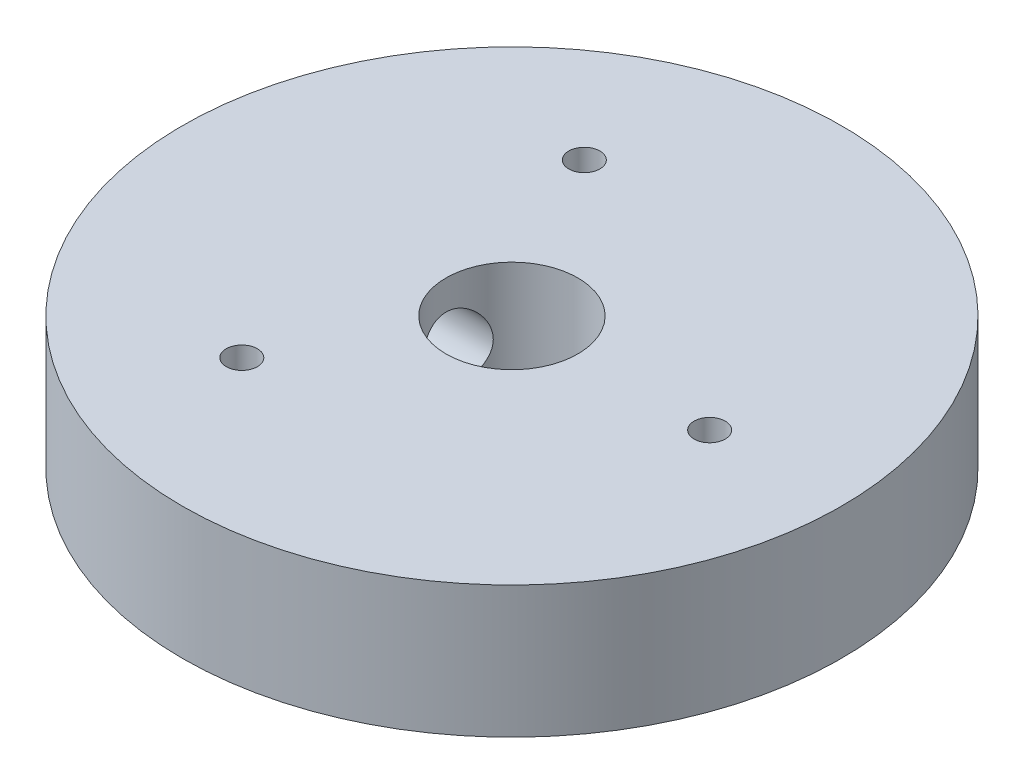
ISO-10303-21;
HEADER;
FILE_DESCRIPTION(('STEP AP214'),'2;1');
FILE_NAME('part.step','',(''),(''),'','','');
FILE_SCHEMA(('AUTOMOTIVE_DESIGN { 1 0 10303 214 1 1 1 1 }'));
ENDSEC;
DATA;
#1=APPLICATION_CONTEXT('core data for automotive mechanical design processes');
#2=APPLICATION_PROTOCOL_DEFINITION('international standard','automotive_design',2000,#1);
#3=PRODUCT_CONTEXT('',#1,'mechanical');
#4=PRODUCT('Part','Part','',(#3));
#5=PRODUCT_RELATED_PRODUCT_CATEGORY('part','',(#4));
#6=PRODUCT_DEFINITION_FORMATION('','',#4);
#7=PRODUCT_DEFINITION_CONTEXT('part definition',#1,'design');
#8=PRODUCT_DEFINITION('design','',#6,#7);
#9=PRODUCT_DEFINITION_SHAPE('','',#8);
#10=(LENGTH_UNIT() NAMED_UNIT(*) SI_UNIT(.MILLI.,.METRE.));
#11=(NAMED_UNIT(*) PLANE_ANGLE_UNIT() SI_UNIT($,.RADIAN.));
#12=(NAMED_UNIT(*) SI_UNIT($,.STERADIAN.) SOLID_ANGLE_UNIT());
#13=UNCERTAINTY_MEASURE_WITH_UNIT(LENGTH_MEASURE(1.E-05),#10,'distance_accuracy_value','');
#14=(GEOMETRIC_REPRESENTATION_CONTEXT(3) GLOBAL_UNCERTAINTY_ASSIGNED_CONTEXT((#13)) GLOBAL_UNIT_ASSIGNED_CONTEXT((#10,
#11,#12)) REPRESENTATION_CONTEXT('',''));
#15=CARTESIAN_POINT('',(0.,0.,0.));
#16=DIRECTION('',(0.,0.,1.));
#17=DIRECTION('',(1.,0.,0.));
#18=AXIS2_PLACEMENT_3D('',#15,#16,#17);
#19=CARTESIAN_POINT('',(0.,3.175,0.));
#20=DIRECTION('',(0.,1.,0.));
#21=DIRECTION('',(0.,0.,1.));
#22=AXIS2_PLACEMENT_3D('',#19,#20,#21);
#23=PLANE('',#22);
#24=CARTESIAN_POINT('',(-4.76249999999999,3.175,8.24889197104678));
#25=DIRECTION('',(0.,1.,0.));
#26=DIRECTION('',(0.,0.,1.));
#27=AXIS2_PLACEMENT_3D('',#24,#25,#26);
#28=CIRCLE('',#27,0.750387242491504);
#29=CARTESIAN_POINT('',(-4.76249999999999,3.175,8.99927921353829));
#30=VERTEX_POINT('',#29);
#31=EDGE_CURVE('E76',#30,#30,#28,.T.);
#32=ORIENTED_EDGE('',*,*,#31,.F.);
#33=EDGE_LOOP('',(#32));
#34=FACE_BOUND('',#33,.T.);
#35=CARTESIAN_POINT('',(0.,3.175,0.));
#36=DIRECTION('',(0.,1.,0.));
#37=DIRECTION('',(0.,0.,1.));
#38=AXIS2_PLACEMENT_3D('',#35,#36,#37);
#39=CIRCLE('',#38,3.175);
#40=CARTESIAN_POINT('',(0.,3.175,3.175));
#41=VERTEX_POINT('',#40);
#42=EDGE_CURVE('E62',#41,#41,#39,.T.);
#43=ORIENTED_EDGE('',*,*,#42,.F.);
#44=EDGE_LOOP('',(#43));
#45=FACE_BOUND('',#44,.T.);
#46=CARTESIAN_POINT('',(0.,3.175,0.));
#47=DIRECTION('',(0.,1.,0.));
#48=DIRECTION('',(0.,0.,1.));
#49=AXIS2_PLACEMENT_3D('',#46,#47,#48);
#50=CIRCLE('',#49,15.875);
#51=CARTESIAN_POINT('',(0.,3.175,15.875));
#52=VERTEX_POINT('',#51);
#53=EDGE_CURVE('E10',#52,#52,#50,.T.);
#54=ORIENTED_EDGE('',*,*,#53,.T.);
#55=EDGE_LOOP('',(#54));
#56=FACE_BOUND('',#55,.T.);
#57=CARTESIAN_POINT('',(9.525,3.175,0.));
#58=DIRECTION('',(0.,1.,0.));
#59=DIRECTION('',(0.,0.,1.));
#60=AXIS2_PLACEMENT_3D('',#57,#58,#59);
#61=CIRCLE('',#60,0.750387242491505);
#62=CARTESIAN_POINT('',(9.525,3.175,0.750387242491505));
#63=VERTEX_POINT('',#62);
#64=EDGE_CURVE('E68',#63,#63,#61,.T.);
#65=ORIENTED_EDGE('',*,*,#64,.F.);
#66=EDGE_LOOP('',(#65));
#67=FACE_BOUND('',#66,.T.);
#68=CARTESIAN_POINT('',(-4.7625,3.175,-8.24889197104678));
#69=DIRECTION('',(0.,1.,0.));
#70=DIRECTION('',(0.,0.,1.));
#71=AXIS2_PLACEMENT_3D('',#68,#69,#70);
#72=CIRCLE('',#71,0.750387242491505);
#73=CARTESIAN_POINT('',(-4.7625,3.175,-7.49850472855527));
#74=VERTEX_POINT('',#73);
#75=EDGE_CURVE('E84',#74,#74,#72,.T.);
#76=ORIENTED_EDGE('',*,*,#75,.F.);
#77=EDGE_LOOP('',(#76));
#78=FACE_BOUND('',#77,.T.);
#79=ADVANCED_FACE('F41',(#34,#45,#56,#67,#78),#23,.T.);
#80=CARTESIAN_POINT('',(0.,-3.175,0.));
#81=DIRECTION('',(0.,1.,0.));
#82=DIRECTION('',(0.,0.,1.));
#83=AXIS2_PLACEMENT_3D('',#80,#81,#82);
#84=PLANE('',#83);
#85=CARTESIAN_POINT('',(0.,-3.175,0.));
#86=DIRECTION('',(0.,1.,0.));
#87=DIRECTION('',(0.,0.,1.));
#88=AXIS2_PLACEMENT_3D('',#85,#86,#87);
#89=CIRCLE('',#88,15.875);
#90=CARTESIAN_POINT('',(0.,-3.175,15.875));
#91=VERTEX_POINT('',#90);
#92=EDGE_CURVE('E56',#91,#91,#89,.T.);
#93=ORIENTED_EDGE('',*,*,#92,.F.);
#94=EDGE_LOOP('',(#93));
#95=FACE_BOUND('',#94,.T.);
#96=CARTESIAN_POINT('',(0.,-3.175,0.));
#97=DIRECTION('',(0.,1.,0.));
#98=DIRECTION('',(0.,0.,1.));
#99=AXIS2_PLACEMENT_3D('',#96,#97,#98);
#100=CIRCLE('',#99,3.175);
#101=CARTESIAN_POINT('',(0.,-3.175,3.175));
#102=VERTEX_POINT('',#101);
#103=EDGE_CURVE('E64',#102,#102,#100,.T.);
#104=ORIENTED_EDGE('',*,*,#103,.T.);
#105=EDGE_LOOP('',(#104));
#106=FACE_BOUND('',#105,.T.);
#107=CARTESIAN_POINT('',(9.525,-3.175,0.));
#108=DIRECTION('',(0.,1.,0.));
#109=DIRECTION('',(0.,0.,1.));
#110=AXIS2_PLACEMENT_3D('',#107,#108,#109);
#111=CIRCLE('',#110,0.750387242491505);
#112=CARTESIAN_POINT('',(9.525,-3.175,0.750387242491505));
#113=VERTEX_POINT('',#112);
#114=EDGE_CURVE('E72',#113,#113,#111,.T.);
#115=ORIENTED_EDGE('',*,*,#114,.T.);
#116=EDGE_LOOP('',(#115));
#117=FACE_BOUND('',#116,.T.);
#118=CARTESIAN_POINT('',(-4.76249999999999,-3.175,8.24889197104678));
#119=DIRECTION('',(0.,1.,0.));
#120=DIRECTION('',(0.,0.,1.));
#121=AXIS2_PLACEMENT_3D('',#118,#119,#120);
#122=CIRCLE('',#121,0.750387242491504);
#123=CARTESIAN_POINT('',(-4.76249999999999,-3.175,8.99927921353829));
#124=VERTEX_POINT('',#123);
#125=EDGE_CURVE('E80',#124,#124,#122,.T.);
#126=ORIENTED_EDGE('',*,*,#125,.T.);
#127=EDGE_LOOP('',(#126));
#128=FACE_BOUND('',#127,.T.);
#129=CARTESIAN_POINT('',(-4.7625,-3.175,-8.24889197104678));
#130=DIRECTION('',(0.,1.,0.));
#131=DIRECTION('',(0.,0.,1.));
#132=AXIS2_PLACEMENT_3D('',#129,#130,#131);
#133=CIRCLE('',#132,0.750387242491505);
#134=CARTESIAN_POINT('',(-4.7625,-3.175,-7.49850472855527));
#135=VERTEX_POINT('',#134);
#136=EDGE_CURVE('E88',#135,#135,#133,.T.);
#137=ORIENTED_EDGE('',*,*,#136,.T.);
#138=EDGE_LOOP('',(#137));
#139=FACE_BOUND('',#138,.T.);
#140=ADVANCED_FACE('F124',(#95,#106,#117,#128,#139),#84,.F.);
#141=CARTESIAN_POINT('',(0.,3.175,0.));
#142=DIRECTION('',(0.,-1.,0.));
#143=DIRECTION('',(0.,0.,-1.));
#144=AXIS2_PLACEMENT_3D('',#141,#142,#143);
#145=CYLINDRICAL_SURFACE('',#144,15.875);
#146=CARTESIAN_POINT('',(-15.875,-1.750000056,0.));
#147=CARTESIAN_POINT('',(-15.8749987707504,-1.74999584185086,-0.0979793643530249));
#148=CARTESIAN_POINT('',(-15.8740833013667,-1.74174380277529,-0.196022150233042));
#149=CARTESIAN_POINT('',(-15.8705193526468,-1.70895155045262,-0.389385738105229));
#150=CARTESIAN_POINT('',(-15.8678690022144,-1.68439375077809,-0.484703485127764));
#151=CARTESIAN_POINT('',(-15.8611342387205,-1.61971693962202,-0.669789190422526));
#152=CARTESIAN_POINT('',(-15.8570507300743,-1.57960774040858,-0.75956060686708));
#153=CARTESIAN_POINT('',(-15.8479053217718,-1.48498669228053,-0.931078842194836));
#154=CARTESIAN_POINT('',(-15.8428436064379,-1.43047755602138,-1.01282716849133));
#155=CARTESIAN_POINT('',(-15.832283565769,-1.30835104975384,-1.16635129833459));
#156=CARTESIAN_POINT('',(-15.8267836315471,-1.24068392637024,-1.23808741687249));
#157=CARTESIAN_POINT('',(-15.8159802044649,-1.0942687401302,-1.36920942645987));
#158=CARTESIAN_POINT('',(-15.8106767210424,-1.01552014577331,-1.42859472478838));
#159=CARTESIAN_POINT('',(-15.8008505262322,-0.848924993605343,-1.53347299357972));
#160=CARTESIAN_POINT('',(-15.7963298762098,-0.76105536173159,-1.578929521488));
#161=CARTESIAN_POINT('',(-15.7886017252672,-0.578871890849666,-1.65442720826407));
#162=CARTESIAN_POINT('',(-15.7853941853144,-0.484558243488575,-1.68446882535031));
#163=CARTESIAN_POINT('',(-15.7806703494868,-0.292571858113271,-1.72816501837791));
#164=CARTESIAN_POINT('',(-15.7791472082895,-0.194914391305205,-1.74188593824553));
#165=CARTESIAN_POINT('',(-15.7779435139746,0.00132818929405485,-1.75275641347327));
#166=CARTESIAN_POINT('',(-15.7782629026333,0.099913273674305,-1.74990649247097));
#167=CARTESIAN_POINT('',(-15.7807019224249,0.29475337547144,-1.72777077884379));
#168=CARTESIAN_POINT('',(-15.7828135924459,0.391016764007342,-1.70855766836944));
#169=CARTESIAN_POINT('',(-15.7885868189893,0.57894442529153,-1.65435417633734));
#170=CARTESIAN_POINT('',(-15.7922484004842,0.670608623910321,-1.61936354056901));
#171=CARTESIAN_POINT('',(-15.8007179991703,0.846964040160319,-1.53451883504015));
#172=CARTESIAN_POINT('',(-15.8055284794751,0.931639743090616,-1.48463277281854));
#173=CARTESIAN_POINT('',(-15.8157518516358,1.09144467320651,-1.37143624395736));
#174=CARTESIAN_POINT('',(-15.8211647649281,1.16657356048189,-1.30812529954477));
#175=CARTESIAN_POINT('',(-15.8320185581079,1.30557439659657,-1.16947142581752));
#176=CARTESIAN_POINT('',(-15.8374594322491,1.36938379519243,-1.09406577254533));
#177=CARTESIAN_POINT('',(-15.847728784908,1.48344868087205,-0.933580066232353));
#178=CARTESIAN_POINT('',(-15.8525572624945,1.53370414734709,-0.848499998481936));
#179=CARTESIAN_POINT('',(-15.8610598804911,1.61923306738655,-0.671035359528453));
#180=CARTESIAN_POINT('',(-15.8647337544272,1.65450306307491,-0.578649108260965));
#181=CARTESIAN_POINT('',(-15.8705106365117,1.70901255824955,-0.389216300339645));
#182=CARTESIAN_POINT('',(-15.8726137017834,1.72825264067658,-0.292169913291171));
#183=CARTESIAN_POINT('',(-15.8750046399331,1.75007614450582,-0.096712983575378));
#184=CARTESIAN_POINT('',(-15.8753019126916,1.75274582314955,0.00168781785082944));
#185=CARTESIAN_POINT('',(-15.874073043414,1.7415797036682,0.197535415328228));
#186=CARTESIAN_POINT('',(-15.87254693142,1.72774417748232,0.294982227070652));
#187=CARTESIAN_POINT('',(-15.8678487150653,1.68403198885939,0.485904597899955));
#188=CARTESIAN_POINT('',(-15.8646807847588,1.65419599832553,0.579389580350867));
#189=CARTESIAN_POINT('',(-15.8570540340655,1.57937179861591,0.760028235948189));
#190=CARTESIAN_POINT('',(-15.8525951789162,1.53438318140011,0.847181738519446));
#191=CARTESIAN_POINT('',(-15.8428612389217,1.43031887501327,1.01307164683578));
#192=CARTESIAN_POINT('',(-15.8375829201735,1.37118684809846,1.09177251849359));
#193=CARTESIAN_POINT('',(-15.8268119373787,1.24059462690878,1.23816274044449));
#194=CARTESIAN_POINT('',(-15.8213192667711,1.1691340550484,1.30585175335472));
#195=CARTESIAN_POINT('',(-15.8107100734737,1.01553547987193,1.42859882917763));
#196=CARTESIAN_POINT('',(-15.805595310404,0.933351921211562,1.48360006057013));
#197=CARTESIAN_POINT('',(-15.7963487008554,0.760863550385964,1.57901887096793));
#198=CARTESIAN_POINT('',(-15.7922168384741,0.6705588696452,1.61943668592425));
#199=CARTESIAN_POINT('',(-15.7854152753184,0.484582147472773,1.68444740085582));
#200=CARTESIAN_POINT('',(-15.7827425148824,0.388921804954169,1.70907343448263));
#201=CARTESIAN_POINT('',(-15.7791525789664,0.194792749055371,1.74190875954436));
#202=CARTESIAN_POINT('',(-15.7782353412616,0.0963241353404615,1.75011863285375));
#203=CARTESIAN_POINT('',(-15.7782618172443,-0.100061266541459,1.74987952324859));
#204=CARTESIAN_POINT('',(-15.7791955582548,-0.197978176891494,1.74151981373045));
#205=CARTESIAN_POINT('',(-15.7827974525154,-0.391007035651755,1.70856673640226));
#206=CARTESIAN_POINT('',(-15.7854656071144,-0.486118981880618,1.68397335596795));
#207=CARTESIAN_POINT('',(-15.7922328084822,-0.670833051399155,1.61927697921681));
#208=CARTESIAN_POINT('',(-15.7963315528257,-0.760436334510245,1.57917726073254));
#209=CARTESIAN_POINT('',(-15.8054986823344,-0.931655560551822,1.48461545462339));
#210=CARTESIAN_POINT('',(-15.8105670688637,-1.01327149224439,1.43015334679154));
#211=CARTESIAN_POINT('',(-15.8211351459263,-1.16665650117076,1.30807874455527));
#212=CARTESIAN_POINT('',(-15.826636932568,-1.23837243958712,1.24039966058607));
#213=CARTESIAN_POINT('',(-15.8374329558805,-1.36946626129314,1.09394780586495));
#214=CARTESIAN_POINT('',(-15.8427271428449,-1.42884120419813,1.01517239876964));
#215=CARTESIAN_POINT('',(-15.8525284351924,-1.53371293329698,0.848499748931197));
#216=CARTESIAN_POINT('',(-15.8570331331814,-1.57916757669441,0.760575865487707));
#217=CARTESIAN_POINT('',(-15.8647225791226,-1.65460517533266,0.578347062586761));
#218=CARTESIAN_POINT('',(-15.8679087939638,-1.68460533373755,0.484049371034498));
#219=CARTESIAN_POINT('',(-15.8718140508065,-1.72091570865995,0.324362345388978));
#220=CARTESIAN_POINT('',(-15.8730031159235,-1.73180714458004,0.25998886124424));
#221=CARTESIAN_POINT('',(-15.8745964975978,-1.74635070179433,0.130419616769645));
#222=CARTESIAN_POINT('',(-15.8750008182989,-1.75000286131598,0.0652238607836776));
#223=CARTESIAN_POINT('',(-15.875,-1.750000056,0.));
#224=B_SPLINE_CURVE_WITH_KNOTS('',3,(#146,#147,#148,#149,#150,#151,#152,#153,#154,#155,#156,
#157,#158,#159,#160,#161,#162,#163,#164,#165,#166,#167,#168,#169,#170,#171,#172,#173,#174,#175,
#176,#177,#178,#179,#180,#181,#182,#183,#184,#185,#186,#187,#188,#189,#190,#191,#192,#193,#194,
#195,#196,#197,#198,#199,#200,#201,#202,#203,#204,#205,#206,#207,#208,#209,#210,#211,#212,#213,
#214,#215,#216,#217,#218,#219,#220,#221,#222,#223),.UNSPECIFIED.,.T.,.F.,(4,2,2,2,2,2,2,2,2,2,2,
2,2,2,2,2,2,2,2,2,2,2,2,2,2,2,2,2,2,2,2,2,2,2,2,2,2,2,4),(0.,0.293699894116223,
0.587717071206363,0.881549037129714,1.17532569050457,1.47023557519066,1.76515960946012,
2.06084880673068,2.3565292139345,2.65100352198026,2.94546852470618,3.23863235130914,
3.53180090159398,3.82560370616381,4.11941696852504,4.41480640062226,4.71019628185575,
5.00565428691476,5.30110154693553,5.59500955739081,5.88891272549456,6.18207233192447,
6.475239833383,6.76959515519251,7.06395949380344,7.3596178087775,7.65527133996119,
7.95030249595024,8.24532319430869,8.53875870419187,8.83219444226791,9.12556818582979,
9.41894234215225,9.71383458954611,10.0087970180838,10.3046437941381,10.6001605327694,
10.7956745809476,10.9911875966985),.UNSPECIFIED.);
#225=CARTESIAN_POINT('',(-15.875,-1.750000056,0.));
#226=VERTEX_POINT('',#225);
#227=EDGE_CURVE('E92',#226,#226,#224,.T.);
#228=ORIENTED_EDGE('',*,*,#227,.T.);
#229=EDGE_LOOP('',(#228));
#230=FACE_BOUND('',#229,.T.);
#231=ORIENTED_EDGE('',*,*,#53,.F.);
#232=EDGE_LOOP('',(#231));
#233=FACE_BOUND('',#232,.T.);
#234=ORIENTED_EDGE('',*,*,#92,.T.);
#235=EDGE_LOOP('',(#234));
#236=FACE_BOUND('',#235,.T.);
#237=ADVANCED_FACE('F43',(#230,#233,#236),#145,.T.);
#238=CARTESIAN_POINT('',(0.,3.175,0.));
#239=DIRECTION('',(0.,-1.,0.));
#240=DIRECTION('',(0.,0.,-1.));
#241=AXIS2_PLACEMENT_3D('',#238,#239,#240);
#242=CYLINDRICAL_SURFACE('',#241,3.175);
#243=CARTESIAN_POINT('',(-2.64917436270246,0.,-1.750000056));
#244=CARTESIAN_POINT('',(-2.64918385448841,0.0896496971028867,-1.74999326161578));
#245=CARTESIAN_POINT('',(-2.65379716200611,0.179376861993647,-1.74306322445384));
#246=CARTESIAN_POINT('',(-2.67152688813019,0.355952181351308,-1.71575502710539));
#247=CARTESIAN_POINT('',(-2.6846575646437,0.442795251192596,-1.69535431624807));
#248=CARTESIAN_POINT('',(-2.71741041168771,0.610693845673109,-1.6423337677931));
#249=CARTESIAN_POINT('',(-2.73699185924493,0.69178189429037,-1.60979041856864));
#250=CARTESIAN_POINT('',(-2.7803735959481,0.84731600906475,-1.53364375949663));
#251=CARTESIAN_POINT('',(-2.80417477660011,0.921760666661549,-1.49003811166872));
#252=CARTESIAN_POINT('',(-2.85625026983947,1.07021286200153,-1.38782879520563));
#253=CARTESIAN_POINT('',(-2.88473338533684,1.1434084672742,-1.32815181985145));
#254=CARTESIAN_POINT('',(-2.94128764537283,1.27940432587279,-1.19771020313399));
#255=CARTESIAN_POINT('',(-2.96935853278268,1.3421983228682,-1.12693893825351));
#256=CARTESIAN_POINT('',(-3.02481353998298,1.46094613402922,-0.968877709797309));
#257=CARTESIAN_POINT('',(-3.05192912448677,1.51584131837475,-0.880689106406349));
#258=CARTESIAN_POINT('',(-3.09958449213699,1.60963793345166,-0.694550642381596));
#259=CARTESIAN_POINT('',(-3.12012930486133,1.64855160369983,-0.596608323375178));
#260=CARTESIAN_POINT('',(-3.15080102112666,1.70585933851585,-0.402394116904287));
#261=CARTESIAN_POINT('',(-3.16165432561257,1.72569497082694,-0.306665099547927));
#262=CARTESIAN_POINT('',(-3.17448423498182,1.74909317124062,-0.112677457298107));
#263=CARTESIAN_POINT('',(-3.17646760496276,1.75266814138312,-0.014420817770946));
#264=CARTESIAN_POINT('',(-3.17161619358722,1.74385452181012,0.170729774019537));
#265=CARTESIAN_POINT('',(-3.16568670076265,1.73310495392767,0.257732148177122));
#266=CARTESIAN_POINT('',(-3.14712818882297,1.69896914402366,0.428466198069249));
#267=CARTESIAN_POINT('',(-3.13449865482026,1.67558193081638,0.512197621905393));
#268=CARTESIAN_POINT('',(-3.10349304241765,1.61683985639969,0.675219970239251));
#269=CARTESIAN_POINT('',(-3.08505707827923,1.58135994630935,0.75445397281839));
#270=CARTESIAN_POINT('',(-3.04400507594473,1.49969566391892,0.905996904394791));
#271=CARTESIAN_POINT('',(-3.02138770614259,1.45350788040725,0.978303616166258));
#272=CARTESIAN_POINT('',(-2.97110831049474,1.34605167068838,1.1223039808596));
#273=CARTESIAN_POINT('',(-2.94316524739801,1.28369250437212,1.19308560023764));
#274=CARTESIAN_POINT('',(-2.8867710411571,1.14852004916248,1.32372645090827));
#275=CARTESIAN_POINT('',(-2.85831939937012,1.07569594481054,1.38357423497449));
#276=CARTESIAN_POINT('',(-2.80127237059439,0.913907187009634,1.49593077935399));
#277=CARTESIAN_POINT('',(-2.77288667322812,0.82408475751696,1.54732286717189));
#278=CARTESIAN_POINT('',(-2.72276218638934,0.635249777518025,1.63392587552982));
#279=CARTESIAN_POINT('',(-2.701015717113,0.536248019251709,1.66915551558647));
#280=CARTESIAN_POINT('',(-2.66930778664096,0.340077223755935,1.71937352211014));
#281=CARTESIAN_POINT('',(-2.65853663871029,0.243405478920368,1.73576638443066));
#282=CARTESIAN_POINT('',(-2.64782677702051,0.048131115744905,1.75207066136936));
#283=CARTESIAN_POINT('',(-2.64787552857264,-0.0504691359786026,1.75200114739349));
#284=CARTESIAN_POINT('',(-2.65794205749601,-0.231287834536205,1.73666773814417));
#285=CARTESIAN_POINT('',(-2.66650056481935,-0.313792832257602,1.7236279000614));
#286=CARTESIAN_POINT('',(-2.69027335651147,-0.475211369261507,1.68628018610389));
#287=CARTESIAN_POINT('',(-2.70549058669232,-0.554123301897287,1.66196732277035));
#288=CARTESIAN_POINT('',(-2.74156807759131,-0.709981082246768,1.60178102086907));
#289=CARTESIAN_POINT('',(-2.76263835795489,-0.786705438048004,1.56546524101012));
#290=CARTESIAN_POINT('',(-2.80794238337291,-0.933431354972227,1.48267028825144));
#291=CARTESIAN_POINT('',(-2.832177686925,-1.0034295743901,1.43618610063624));
#292=CARTESIAN_POINT('',(-2.88570531224475,-1.14640387158906,1.32576861660979));
#293=CARTESIAN_POINT('',(-2.91518832364563,-1.21807883696513,1.26023539531736));
#294=CARTESIAN_POINT('',(-2.97269819693498,-1.34993760613082,1.117850460125));
#295=CARTESIAN_POINT('',(-3.00072418812936,-1.4101145950698,1.04099208130373));
#296=CARTESIAN_POINT('',(-3.05393078717877,-1.52013344987543,0.873079838528892));
#297=CARTESIAN_POINT('',(-3.07889194781403,-1.56928755520311,0.781500319016455));
#298=CARTESIAN_POINT('',(-3.1213139888173,-1.65096933275557,0.589611061516065));
#299=CARTESIAN_POINT('',(-3.13878268973016,-1.68351434813312,0.489310558604329));
#300=CARTESIAN_POINT('',(-3.16274739019494,-1.72775917732841,0.293842567989956));
#301=CARTESIAN_POINT('',(-3.17018107165334,-1.74124700741885,0.199195475251485));
#302=CARTESIAN_POINT('',(-3.17641471276469,-1.75257308378441,0.00870346362101644));
#303=CARTESIAN_POINT('',(-3.17521926427679,-1.75041965331264,-0.0871407911161623));
#304=CARTESIAN_POINT('',(-3.16483980659949,-1.73151253837801,-0.268133438177437));
#305=CARTESIAN_POINT('',(-3.15638402487377,-1.71608954103647,-0.353468459947196));
#306=CARTESIAN_POINT('',(-3.13323638047798,-1.67313243858794,-0.520130508406468));
#307=CARTESIAN_POINT('',(-3.11854377677624,-1.64559689430744,-0.601457057544966));
#308=CARTESIAN_POINT('',(-3.08357618105101,-1.57834380199357,-0.760973060712078));
#309=CARTESIAN_POINT('',(-3.06312880183229,-1.5382448626645,-0.838962651002632));
#310=CARTESIAN_POINT('',(-3.01856863975403,-1.44747859273495,-0.987360496333096));
#311=CARTESIAN_POINT('',(-2.99445438343456,-1.39680701067354,-1.05776568421828));
#312=CARTESIAN_POINT('',(-2.94152278209465,-1.27963824025107,-1.19761472397994));
#313=CARTESIAN_POINT('',(-2.91248375042643,-1.21198998053949,-1.26601171307923));
#314=CARTESIAN_POINT('',(-2.85490284292309,-1.06622179521491,-1.39100765203676));
#315=CARTESIAN_POINT('',(-2.82636161557882,-0.98808921774006,-1.44759213304904));
#316=CARTESIAN_POINT('',(-2.77105295350341,-0.817064188629664,-1.55098496285746));
#317=CARTESIAN_POINT('',(-2.74453415910278,-0.72353228816281,-1.5968791133757));
#318=CARTESIAN_POINT('',(-2.69966866572343,-0.528204850865131,-1.67163054106401));
#319=CARTESIAN_POINT('',(-2.68129603057315,-0.426436778588969,-1.70054198557177));
#320=CARTESIAN_POINT('',(-2.66231829217209,-0.269440691393516,-1.72997448114511));
#321=CARTESIAN_POINT('',(-2.65741895945966,-0.215956650229352,-1.73746517738972));
#322=CARTESIAN_POINT('',(-2.65084417212415,-0.108324490444441,-1.7474799478399));
#323=CARTESIAN_POINT('',(-2.64916862670201,-0.0541763905703611,-1.75000416192813));
#324=CARTESIAN_POINT('',(-2.64917436270246,0.,-1.750000056));
#325=B_SPLINE_CURVE_WITH_KNOTS('',3,(#243,#244,#245,#246,#247,#248,#249,#250,#251,#252,#253,
#254,#255,#256,#257,#258,#259,#260,#261,#262,#263,#264,#265,#266,#267,#268,#269,#270,#271,#272,
#273,#274,#275,#276,#277,#278,#279,#280,#281,#282,#283,#284,#285,#286,#287,#288,#289,#290,#291,
#292,#293,#294,#295,#296,#297,#298,#299,#300,#301,#302,#303,#304,#305,#306,#307,#308,#309,#310,
#311,#312,#313,#314,#315,#316,#317,#318,#319,#320,#321,#322,#323,#324),.UNSPECIFIED.,.T.,.F.,(4,
2,2,2,2,2,2,2,2,2,2,2,2,2,2,2,2,2,2,2,2,2,2,2,2,2,2,2,2,2,2,2,2,2,2,2,2,2,2,2,4),(0.,
0.268719008436241,0.537889012102053,0.805391336146134,1.07295024309329,1.36767699952811,
1.66258038871965,1.98294481230931,2.3030634237173,2.59646362535821,2.88964001250733,
3.15198928315541,3.41435871785299,3.67952801613242,3.94478190586576,4.2387230262758,
4.53297014777418,4.85323230564404,5.17312259021989,5.46718766769037,5.76091207702776,
6.01167172214624,6.26254241540702,6.52394137671784,6.78546954297712,7.08864799398028,
7.39200558519548,7.71091074667112,8.02948222364581,8.3155503484338,8.60146625768297,
8.86166458672553,9.12189384004337,9.39094651729232,9.66010759497879,9.96030369355963,
10.2608653648906,10.581654440196,10.9014147047144,11.0638094085454,11.2261995384084),.UNSPECIFIED.);
#326=CARTESIAN_POINT('',(-2.64917436270246,0.,-1.750000056));
#327=VERTEX_POINT('',#326);
#328=EDGE_CURVE('E46',#327,#327,#325,.T.);
#329=ORIENTED_EDGE('',*,*,#328,.F.);
#330=EDGE_LOOP('',(#329));
#331=FACE_BOUND('',#330,.T.);
#332=ORIENTED_EDGE('',*,*,#42,.T.);
#333=EDGE_LOOP('',(#332));
#334=FACE_BOUND('',#333,.T.);
#335=ORIENTED_EDGE('',*,*,#103,.F.);
#336=EDGE_LOOP('',(#335));
#337=FACE_BOUND('',#336,.T.);
#338=ADVANCED_FACE('F117',(#331,#334,#337),#242,.F.);
#339=CARTESIAN_POINT('',(9.525,3.175,0.));
#340=DIRECTION('',(0.,-1.,0.));
#341=DIRECTION('',(0.,0.,-1.));
#342=AXIS2_PLACEMENT_3D('',#339,#340,#341);
#343=CYLINDRICAL_SURFACE('',#342,0.750387242491505);
#344=ORIENTED_EDGE('',*,*,#64,.T.);
#345=EDGE_LOOP('',(#344));
#346=FACE_BOUND('',#345,.T.);
#347=ORIENTED_EDGE('',*,*,#114,.F.);
#348=EDGE_LOOP('',(#347));
#349=FACE_BOUND('',#348,.T.);
#350=ADVANCED_FACE('F114',(#346,#349),#343,.F.);
#351=CARTESIAN_POINT('',(-4.76249999999999,3.175,8.24889197104678));
#352=DIRECTION('',(0.,-1.,0.));
#353=DIRECTION('',(0.,0.,-1.));
#354=AXIS2_PLACEMENT_3D('',#351,#352,#353);
#355=CYLINDRICAL_SURFACE('',#354,0.750387242491504);
#356=ORIENTED_EDGE('',*,*,#31,.T.);
#357=EDGE_LOOP('',(#356));
#358=FACE_BOUND('',#357,.T.);
#359=ORIENTED_EDGE('',*,*,#125,.F.);
#360=EDGE_LOOP('',(#359));
#361=FACE_BOUND('',#360,.T.);
#362=ADVANCED_FACE('F110',(#358,#361),#355,.F.);
#363=CARTESIAN_POINT('',(-4.7625,3.175,-8.24889197104678));
#364=DIRECTION('',(0.,-1.,0.));
#365=DIRECTION('',(0.,0.,-1.));
#366=AXIS2_PLACEMENT_3D('',#363,#364,#365);
#367=CYLINDRICAL_SURFACE('',#366,0.750387242491505);
#368=ORIENTED_EDGE('',*,*,#75,.T.);
#369=EDGE_LOOP('',(#368));
#370=FACE_BOUND('',#369,.T.);
#371=ORIENTED_EDGE('',*,*,#136,.F.);
#372=EDGE_LOOP('',(#371));
#373=FACE_BOUND('',#372,.T.);
#374=ADVANCED_FACE('F105',(#370,#373),#367,.F.);
#375=CARTESIAN_POINT('',(-15.875,0.,0.));
#376=DIRECTION('',(1.,0.,0.));
#377=DIRECTION('',(0.,0.,-1.));
#378=AXIS2_PLACEMENT_3D('',#375,#376,#377);
#379=CYLINDRICAL_SURFACE('',#378,1.750000056);
#380=ORIENTED_EDGE('',*,*,#328,.T.);
#381=EDGE_LOOP('',(#380));
#382=FACE_BOUND('',#381,.T.);
#383=ORIENTED_EDGE('',*,*,#227,.F.);
#384=EDGE_LOOP('',(#383));
#385=FACE_BOUND('',#384,.T.);
#386=ADVANCED_FACE('F101',(#382,#385),#379,.F.);
#387=CLOSED_SHELL('',(#79,#140,#237,#338,#350,#362,#374,#386));
#388=MANIFOLD_SOLID_BREP('B2',#387);
#389=ADVANCED_BREP_SHAPE_REPRESENTATION('',(#18,#388),#14);
#390=SHAPE_DEFINITION_REPRESENTATION(#9,#389);
ENDSEC;
END-ISO-10303-21;
